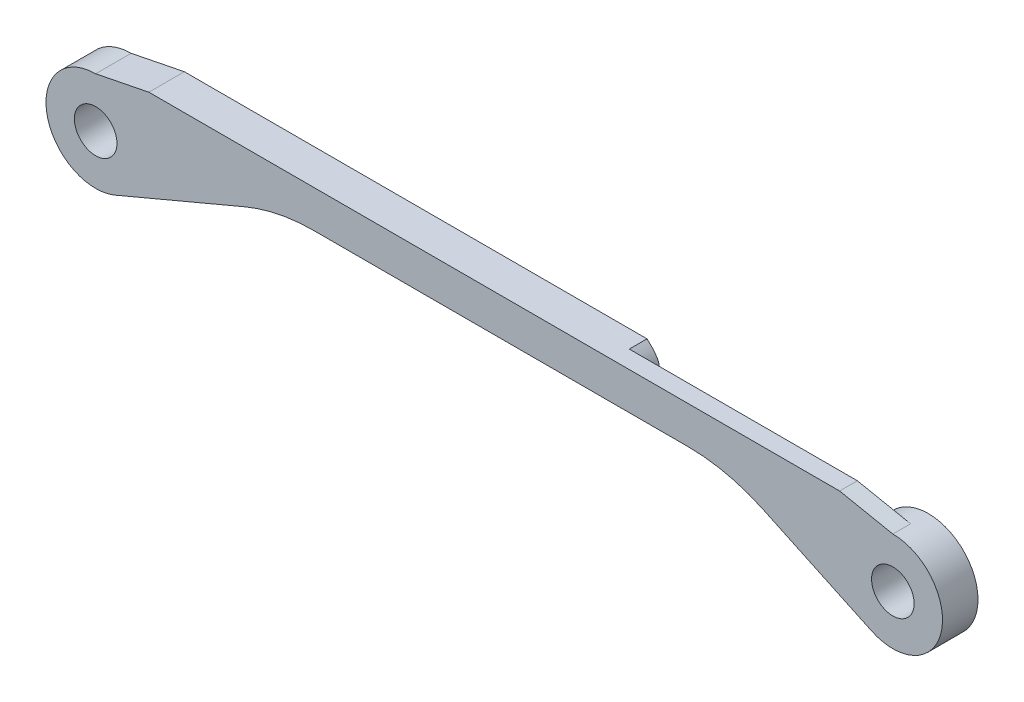
ISO-10303-21;
HEADER;
FILE_DESCRIPTION(('STEP AP214'),'2;1');
FILE_NAME('part.step','',(''),(''),'','','');
FILE_SCHEMA(('AUTOMOTIVE_DESIGN { 1 0 10303 214 1 1 1 1 }'));
ENDSEC;
DATA;
#1=APPLICATION_CONTEXT('core data for automotive mechanical design processes');
#2=APPLICATION_PROTOCOL_DEFINITION('international standard','automotive_design',2000,#1);
#3=PRODUCT_CONTEXT('',#1,'mechanical');
#4=PRODUCT('Part','Part','',(#3));
#5=PRODUCT_RELATED_PRODUCT_CATEGORY('part','',(#4));
#6=PRODUCT_DEFINITION_FORMATION('','',#4);
#7=PRODUCT_DEFINITION_CONTEXT('part definition',#1,'design');
#8=PRODUCT_DEFINITION('design','',#6,#7);
#9=PRODUCT_DEFINITION_SHAPE('','',#8);
#10=(LENGTH_UNIT() NAMED_UNIT(*) SI_UNIT(.MILLI.,.METRE.));
#11=(NAMED_UNIT(*) PLANE_ANGLE_UNIT() SI_UNIT($,.RADIAN.));
#12=(NAMED_UNIT(*) SI_UNIT($,.STERADIAN.) SOLID_ANGLE_UNIT());
#13=UNCERTAINTY_MEASURE_WITH_UNIT(LENGTH_MEASURE(1.E-05),#10,'distance_accuracy_value','');
#14=(GEOMETRIC_REPRESENTATION_CONTEXT(3) GLOBAL_UNCERTAINTY_ASSIGNED_CONTEXT((#13)) GLOBAL_UNIT_ASSIGNED_CONTEXT((#10,
#11,#12)) REPRESENTATION_CONTEXT('',''));
#15=CARTESIAN_POINT('',(0.,0.,0.));
#16=DIRECTION('',(0.,0.,1.));
#17=DIRECTION('',(1.,0.,0.));
#18=AXIS2_PLACEMENT_3D('',#15,#16,#17);
#19=CARTESIAN_POINT('',(-57.845130198065,-43.5295238724371,-5.));
#20=DIRECTION('',(0.,0.,-1.));
#21=DIRECTION('',(1.,0.,0.));
#22=AXIS2_PLACEMENT_3D('',#19,#20,#21);
#23=PLANE('',#22);
#24=DIRECTION('',(0.905027741446098,-0.425352544617962,0.));
#25=VECTOR('',#24,1.);
#26=CARTESIAN_POINT('',(-5.95493562465147,-12.6703883802454,-5.));
#27=LINE('',#26,#25);
#28=CARTESIAN_POINT('',(-36.577502967167,1.7218631998678,-5.));
#29=VERTEX_POINT('',#28);
#30=CARTESIAN_POINT('',(-5.95493562465147,-12.6703883802454,-5.));
#31=VERTEX_POINT('',#30);
#32=EDGE_CURVE('E161',#29,#31,#27,.T.);
#33=ORIENTED_EDGE('',*,*,#32,.F.);
#34=CARTESIAN_POINT('',(-57.845130198065,-43.5295238724371,-5.));
#35=DIRECTION('',(0.,0.,1.));
#36=DIRECTION('',(1.,0.,0.));
#37=AXIS2_PLACEMENT_3D('',#34,#35,#36);
#38=CIRCLE('',#37,50.);
#39=CARTESIAN_POINT('',(-57.845130198065,6.47047612756292,-5.));
#40=VERTEX_POINT('',#39);
#41=EDGE_CURVE('E165',#29,#40,#38,.T.);
#42=ORIENTED_EDGE('',*,*,#41,.T.);
#43=DIRECTION('',(1.,0.,0.));
#44=VECTOR('',#43,1.);
#45=CARTESIAN_POINT('',(0.,6.47047612756292,-5.));
#46=LINE('',#45,#44);
#47=CARTESIAN_POINT('',(-81.2732419921328,6.47047612756292,-5.));
#48=VERTEX_POINT('',#47);
#49=EDGE_CURVE('E451',#48,#40,#46,.T.);
#50=ORIENTED_EDGE('',*,*,#49,.F.);
#51=CARTESIAN_POINT('',(-79.2716069594435,17.,-5.));
#52=CARTESIAN_POINT('',(-71.4034946211549,10.2559083754016,-5.));
#53=CARTESIAN_POINT('',(-81.2732419921328,6.47047612756292,-5.));
#54=B_SPLINE_CURVE_WITH_KNOTS('',2,(#51,#52,#53),.UNSPECIFIED.,.F.,.F.,(3,3),(0.,1.),.UNSPECIFIED.);
#55=CARTESIAN_POINT('',(-79.2716069594435,17.,-5.));
#56=VERTEX_POINT('',#55);
#57=EDGE_CURVE('E163',#56,#48,#54,.T.);
#58=ORIENTED_EDGE('',*,*,#57,.F.);
#59=DIRECTION('',(-1.,0.,0.));
#60=VECTOR('',#59,1.);
#61=CARTESIAN_POINT('',(0.,17.,-5.));
#62=LINE('',#61,#60);
#63=CARTESIAN_POINT('',(-15.,17.,-5.));
#64=VERTEX_POINT('',#63);
#65=EDGE_CURVE('E160',#64,#56,#62,.T.);
#66=ORIENTED_EDGE('',*,*,#65,.F.);
#67=DIRECTION('',(-0.98058067569092,0.196116135138185,0.));
#68=VECTOR('',#67,1.);
#69=CARTESIAN_POINT('',(2.69230769230771,13.4615384615385,-5.));
#70=LINE('',#69,#68);
#71=CARTESIAN_POINT('',(0.,14.,-5.));
#72=VERTEX_POINT('',#71);
#73=EDGE_CURVE('E139',#72,#64,#70,.T.);
#74=ORIENTED_EDGE('',*,*,#73,.F.);
#75=CARTESIAN_POINT('',(0.,0.,-5.));
#76=DIRECTION('',(0.,0.,1.));
#77=DIRECTION('',(1.,0.,0.));
#78=AXIS2_PLACEMENT_3D('',#75,#76,#77);
#79=CIRCLE('',#78,14.);
#80=EDGE_CURVE('E149',#72,#31,#79,.T.);
#81=ORIENTED_EDGE('',*,*,#80,.T.);
#82=EDGE_LOOP('',(#33,#42,#50,#58,#66,#74,#81));
#83=FACE_BOUND('',#82,.T.);
#84=ADVANCED_FACE('F45',(#83),#23,.T.);
#85=CARTESIAN_POINT('',(-5.95493562465147,-12.6703883802454,-10.));
#86=DIRECTION('',(0.425352544617962,0.905027741446098,0.));
#87=DIRECTION('',(-0.905027741446098,0.425352544617962,0.));
#88=AXIS2_PLACEMENT_3D('',#85,#86,#87);
#89=PLANE('',#88);
#90=ORIENTED_EDGE('',*,*,#32,.T.);
#91=DIRECTION('',(0.,0.,1.));
#92=VECTOR('',#91,1.);
#93=CARTESIAN_POINT('',(-5.95493562465147,-12.6703883802454,-10.));
#94=LINE('',#93,#92);
#95=CARTESIAN_POINT('',(-5.95493562465147,-12.6703883802454,0.));
#96=VERTEX_POINT('',#95);
#97=EDGE_CURVE('E145',#31,#96,#94,.T.);
#98=ORIENTED_EDGE('',*,*,#97,.T.);
#99=DIRECTION('',(0.905027741446098,-0.425352544617962,0.));
#100=VECTOR('',#99,1.);
#101=CARTESIAN_POINT('',(-5.95493562465147,-12.6703883802454,0.));
#102=LINE('',#101,#100);
#103=CARTESIAN_POINT('',(-36.577502967167,1.7218631998678,0.));
#104=VERTEX_POINT('',#103);
#105=EDGE_CURVE('E463',#104,#96,#102,.T.);
#106=ORIENTED_EDGE('',*,*,#105,.F.);
#107=DIRECTION('',(0.,0.,1.));
#108=VECTOR('',#107,1.);
#109=CARTESIAN_POINT('',(-36.5775029671669,1.7218631998678,0.));
#110=LINE('',#109,#108);
#111=EDGE_CURVE('E457',#29,#104,#110,.T.);
#112=ORIENTED_EDGE('',*,*,#111,.F.);
#113=EDGE_LOOP('',(#90,#98,#106,#112));
#114=FACE_BOUND('',#113,.T.);
#115=ADVANCED_FACE('F230',(#114),#89,.F.);
#116=CARTESIAN_POINT('',(0.,0.,-10.));
#117=DIRECTION('',(0.,0.,1.));
#118=DIRECTION('',(-1.,0.,0.));
#119=AXIS2_PLACEMENT_3D('',#116,#117,#118);
#120=CYLINDRICAL_SURFACE('',#119,14.);
#121=DIRECTION('',(0.,0.,1.));
#122=VECTOR('',#121,1.);
#123=CARTESIAN_POINT('',(0.,14.,-10.));
#124=LINE('',#123,#122);
#125=CARTESIAN_POINT('',(0.,14.,0.));
#126=VERTEX_POINT('',#125);
#127=EDGE_CURVE('E134',#72,#126,#124,.T.);
#128=ORIENTED_EDGE('',*,*,#127,.T.);
#129=CARTESIAN_POINT('',(0.,0.,0.));
#130=DIRECTION('',(0.,0.,1.));
#131=DIRECTION('',(1.,0.,0.));
#132=AXIS2_PLACEMENT_3D('',#129,#130,#131);
#133=CIRCLE('',#132,14.);
#134=EDGE_CURVE('E464',#96,#126,#133,.T.);
#135=ORIENTED_EDGE('',*,*,#134,.F.);
#136=ORIENTED_EDGE('',*,*,#97,.F.);
#137=ORIENTED_EDGE('',*,*,#80,.F.);
#138=EDGE_LOOP('',(#128,#135,#136,#137));
#139=FACE_BOUND('',#138,.T.);
#140=CARTESIAN_POINT('',(0.,0.,-10.));
#141=DIRECTION('',(0.,0.,1.));
#142=DIRECTION('',(1.,0.,0.));
#143=AXIS2_PLACEMENT_3D('',#140,#141,#142);
#144=CIRCLE('',#143,14.);
#145=CARTESIAN_POINT('',(14.,0.,-10.));
#146=VERTEX_POINT('',#145);
#147=EDGE_CURVE('E449',#146,#146,#144,.T.);
#148=ORIENTED_EDGE('',*,*,#147,.T.);
#149=EDGE_LOOP('',(#148));
#150=FACE_BOUND('',#149,.T.);
#151=ADVANCED_FACE('F150',(#139,#150),#120,.T.);
#152=CARTESIAN_POINT('',(2.69230769230771,13.4615384615385,-10.));
#153=DIRECTION('',(0.196116135138185,0.98058067569092,0.));
#154=DIRECTION('',(-0.98058067569092,0.196116135138185,0.));
#155=AXIS2_PLACEMENT_3D('',#152,#153,#154);
#156=PLANE('',#155);
#157=DIRECTION('',(0.,0.,1.));
#158=VECTOR('',#157,1.);
#159=CARTESIAN_POINT('',(-15.,17.,-10.));
#160=LINE('',#159,#158);
#161=CARTESIAN_POINT('',(-15.,17.,0.));
#162=VERTEX_POINT('',#161);
#163=EDGE_CURVE('E146',#64,#162,#160,.T.);
#164=ORIENTED_EDGE('',*,*,#163,.T.);
#165=DIRECTION('',(0.98058067569092,-0.196116135138185,0.));
#166=VECTOR('',#165,1.);
#167=CARTESIAN_POINT('',(2.69230769230771,13.4615384615385,0.));
#168=LINE('',#167,#166);
#169=EDGE_CURVE('E142',#162,#126,#168,.T.);
#170=ORIENTED_EDGE('',*,*,#169,.T.);
#171=ORIENTED_EDGE('',*,*,#127,.F.);
#172=ORIENTED_EDGE('',*,*,#73,.T.);
#173=EDGE_LOOP('',(#164,#170,#171,#172));
#174=FACE_BOUND('',#173,.T.);
#175=ADVANCED_FACE('F137',(#174),#156,.T.);
#176=CARTESIAN_POINT('',(0.,0.,-10.));
#177=DIRECTION('',(0.,0.,1.));
#178=DIRECTION('',(-1.,0.,0.));
#179=AXIS2_PLACEMENT_3D('',#176,#177,#178);
#180=CYLINDRICAL_SURFACE('',#179,6.);
#181=CARTESIAN_POINT('',(0.,0.,0.));
#182=DIRECTION('',(0.,0.,1.));
#183=DIRECTION('',(1.,0.,0.));
#184=AXIS2_PLACEMENT_3D('',#181,#182,#183);
#185=CIRCLE('',#184,6.);
#186=CARTESIAN_POINT('',(6.,0.,0.));
#187=VERTEX_POINT('',#186);
#188=EDGE_CURVE('E486',#187,#187,#185,.T.);
#189=ORIENTED_EDGE('',*,*,#188,.T.);
#190=EDGE_LOOP('',(#189));
#191=FACE_BOUND('',#190,.T.);
#192=CARTESIAN_POINT('',(0.,0.,-10.));
#193=DIRECTION('',(0.,0.,1.));
#194=DIRECTION('',(1.,0.,0.));
#195=AXIS2_PLACEMENT_3D('',#192,#193,#194);
#196=CIRCLE('',#195,6.);
#197=CARTESIAN_POINT('',(6.,0.,-10.));
#198=VERTEX_POINT('',#197);
#199=EDGE_CURVE('E156',#198,#198,#196,.F.);
#200=ORIENTED_EDGE('',*,*,#199,.T.);
#201=EDGE_LOOP('',(#200));
#202=FACE_BOUND('',#201,.T.);
#203=ADVANCED_FACE('F202',(#191,#202),#180,.F.);
#204=CARTESIAN_POINT('',(-57.845130198065,-43.5295238724371,-10.));
#205=DIRECTION('',(0.,0.,-1.));
#206=DIRECTION('',(1.,0.,0.));
#207=AXIS2_PLACEMENT_3D('',#204,#205,#206);
#208=CYLINDRICAL_SURFACE('',#207,50.);
#209=ORIENTED_EDGE('',*,*,#41,.F.);
#210=ORIENTED_EDGE('',*,*,#111,.T.);
#211=CARTESIAN_POINT('',(-57.845130198065,-43.5295238724371,0.));
#212=DIRECTION('',(0.,0.,1.));
#213=DIRECTION('',(1.,0.,0.));
#214=AXIS2_PLACEMENT_3D('',#211,#212,#213);
#215=CIRCLE('',#214,50.);
#216=CARTESIAN_POINT('',(-57.845130198065,6.47047612756292,0.));
#217=VERTEX_POINT('',#216);
#218=EDGE_CURVE('E459',#104,#217,#215,.T.);
#219=ORIENTED_EDGE('',*,*,#218,.T.);
#220=DIRECTION('',(0.,0.,1.));
#221=VECTOR('',#220,1.);
#222=CARTESIAN_POINT('',(-57.845130198065,6.47047612756292,-10.));
#223=LINE('',#222,#221);
#224=EDGE_CURVE('E60',#217,#40,#223,.F.);
#225=ORIENTED_EDGE('',*,*,#224,.T.);
#226=EDGE_LOOP('',(#209,#210,#219,#225));
#227=FACE_BOUND('',#226,.T.);
#228=ADVANCED_FACE('F205',(#227),#208,.F.);
#229=CARTESIAN_POINT('',(0.,17.,-10.));
#230=DIRECTION('',(0.,1.,0.));
#231=DIRECTION('',(-1.,0.,0.));
#232=AXIS2_PLACEMENT_3D('',#229,#230,#231);
#233=PLANE('',#232);
#234=DIRECTION('',(0.,0.,-1.));
#235=VECTOR('',#234,1.);
#236=CARTESIAN_POINT('',(-79.2716069594435,17.,-5.));
#237=LINE('',#236,#235);
#238=CARTESIAN_POINT('',(-79.2716069594435,17.,-10.));
#239=VERTEX_POINT('',#238);
#240=EDGE_CURVE('E174',#56,#239,#237,.T.);
#241=ORIENTED_EDGE('',*,*,#240,.T.);
#242=DIRECTION('',(1.,0.,0.));
#243=VECTOR('',#242,1.);
#244=CARTESIAN_POINT('',(0.,17.,-10.));
#245=LINE('',#244,#243);
#246=CARTESIAN_POINT('',(-209.65,17.,-10.));
#247=VERTEX_POINT('',#246);
#248=EDGE_CURVE('E492',#247,#239,#245,.T.);
#249=ORIENTED_EDGE('',*,*,#248,.F.);
#250=DIRECTION('',(0.,0.,1.));
#251=VECTOR('',#250,1.);
#252=CARTESIAN_POINT('',(-209.65,17.,-10.));
#253=LINE('',#252,#251);
#254=CARTESIAN_POINT('',(-209.65,17.,0.));
#255=VERTEX_POINT('',#254);
#256=EDGE_CURVE('E499',#247,#255,#253,.T.);
#257=ORIENTED_EDGE('',*,*,#256,.T.);
#258=DIRECTION('',(1.,0.,0.));
#259=VECTOR('',#258,1.);
#260=CARTESIAN_POINT('',(0.,17.,0.));
#261=LINE('',#260,#259);
#262=EDGE_CURVE('E474',#255,#162,#261,.T.);
#263=ORIENTED_EDGE('',*,*,#262,.T.);
#264=ORIENTED_EDGE('',*,*,#163,.F.);
#265=ORIENTED_EDGE('',*,*,#65,.T.);
#266=EDGE_LOOP('',(#241,#249,#257,#263,#264,#265));
#267=FACE_BOUND('',#266,.T.);
#268=ADVANCED_FACE('F221',(#267),#233,.T.);
#269=CARTESIAN_POINT('',(-11.3326923076922,56.6634615384613,-10.));
#270=DIRECTION('',(0.196116135138183,-0.98058067569092,0.));
#271=DIRECTION('',(0.98058067569092,0.196116135138183,0.));
#272=AXIS2_PLACEMENT_3D('',#269,#270,#271);
#273=PLANE('',#272);
#274=DIRECTION('',(-0.98058067569092,-0.196116135138183,0.));
#275=VECTOR('',#274,1.);
#276=CARTESIAN_POINT('',(-11.3326923076922,56.6634615384613,0.));
#277=LINE('',#276,#275);
#278=CARTESIAN_POINT('',(-224.65,14.,0.));
#279=VERTEX_POINT('',#278);
#280=EDGE_CURVE('E476',#255,#279,#277,.T.);
#281=ORIENTED_EDGE('',*,*,#280,.F.);
#282=ORIENTED_EDGE('',*,*,#256,.F.);
#283=DIRECTION('',(-0.98058067569092,-0.196116135138183,0.));
#284=VECTOR('',#283,1.);
#285=CARTESIAN_POINT('',(-11.3326923076922,56.6634615384613,-10.));
#286=LINE('',#285,#284);
#287=CARTESIAN_POINT('',(-224.65,14.,-10.));
#288=VERTEX_POINT('',#287);
#289=EDGE_CURVE('E522',#247,#288,#286,.T.);
#290=ORIENTED_EDGE('',*,*,#289,.T.);
#291=DIRECTION('',(0.,0.,1.));
#292=VECTOR('',#291,1.);
#293=CARTESIAN_POINT('',(-224.65,14.,-10.));
#294=LINE('',#293,#292);
#295=EDGE_CURVE('E496',#288,#279,#294,.T.);
#296=ORIENTED_EDGE('',*,*,#295,.T.);
#297=EDGE_LOOP('',(#281,#282,#290,#296));
#298=FACE_BOUND('',#297,.T.);
#299=ADVANCED_FACE('F217',(#298),#273,.F.);
#300=CARTESIAN_POINT('',(-224.65,0.,-10.));
#301=DIRECTION('',(0.,0.,1.));
#302=DIRECTION('',(-1.,0.,0.));
#303=AXIS2_PLACEMENT_3D('',#300,#301,#302);
#304=CYLINDRICAL_SURFACE('',#303,14.);
#305=CARTESIAN_POINT('',(-224.65,0.,0.));
#306=DIRECTION('',(0.,0.,1.));
#307=DIRECTION('',(1.,0.,0.));
#308=AXIS2_PLACEMENT_3D('',#305,#306,#307);
#309=CIRCLE('',#308,14.);
#310=CARTESIAN_POINT('',(-219.205808477167,-12.8980920551341,0.));
#311=VERTEX_POINT('',#310);
#312=EDGE_CURVE('E479',#279,#311,#309,.T.);
#313=ORIENTED_EDGE('',*,*,#312,.F.);
#314=ORIENTED_EDGE('',*,*,#295,.F.);
#315=CARTESIAN_POINT('',(-224.65,0.,-10.));
#316=DIRECTION('',(0.,0.,1.));
#317=DIRECTION('',(1.,0.,0.));
#318=AXIS2_PLACEMENT_3D('',#315,#316,#317);
#319=CIRCLE('',#318,14.);
#320=CARTESIAN_POINT('',(-219.205808477167,-12.8980920551341,-10.));
#321=VERTEX_POINT('',#320);
#322=EDGE_CURVE('E525',#288,#321,#319,.T.);
#323=ORIENTED_EDGE('',*,*,#322,.T.);
#324=DIRECTION('',(0.,0.,1.));
#325=VECTOR('',#324,1.);
#326=CARTESIAN_POINT('',(-219.205808477167,-12.8980920551341,-10.));
#327=LINE('',#326,#325);
#328=EDGE_CURVE('E493',#321,#311,#327,.T.);
#329=ORIENTED_EDGE('',*,*,#328,.T.);
#330=EDGE_LOOP('',(#313,#314,#323,#329));
#331=FACE_BOUND('',#330,.T.);
#332=ADVANCED_FACE('F213',(#331),#304,.T.);
#333=CARTESIAN_POINT('',(-28.527497627278,67.5858461180238,-10.));
#334=DIRECTION('',(0.38887082305951,-0.921292289652431,0.));
#335=DIRECTION('',(0.921292289652431,0.38887082305951,0.));
#336=AXIS2_PLACEMENT_3D('',#333,#334,#335);
#337=PLANE('',#336);
#338=DIRECTION('',(-0.921292289652431,-0.38887082305951,0.));
#339=VECTOR('',#338,1.);
#340=CARTESIAN_POINT('',(-28.527497627278,67.5858461180238,0.));
#341=LINE('',#340,#339);
#342=CARTESIAN_POINT('',(-182.642324278252,2.53509061018449,0.));
#343=VERTEX_POINT('',#342);
#344=EDGE_CURVE('E482',#343,#311,#341,.T.);
#345=ORIENTED_EDGE('',*,*,#344,.T.);
#346=ORIENTED_EDGE('',*,*,#328,.F.);
#347=DIRECTION('',(-0.921292289652431,-0.38887082305951,0.));
#348=VECTOR('',#347,1.);
#349=CARTESIAN_POINT('',(-28.527497627278,67.5858461180238,-10.));
#350=LINE('',#349,#348);
#351=CARTESIAN_POINT('',(-182.642324278252,2.53509061018449,-10.));
#352=VERTEX_POINT('',#351);
#353=EDGE_CURVE('E515',#352,#321,#350,.T.);
#354=ORIENTED_EDGE('',*,*,#353,.F.);
#355=DIRECTION('',(0.,0.,1.));
#356=VECTOR('',#355,1.);
#357=CARTESIAN_POINT('',(-182.642324278252,2.53509061018448,-10.));
#358=LINE('',#357,#356);
#359=EDGE_CURVE('E507',#343,#352,#358,.F.);
#360=ORIENTED_EDGE('',*,*,#359,.F.);
#361=EDGE_LOOP('',(#345,#346,#354,#360));
#362=FACE_BOUND('',#361,.T.);
#363=ADVANCED_FACE('F209',(#362),#337,.T.);
#364=CARTESIAN_POINT('',(0.,6.47047612756292,-10.));
#365=DIRECTION('',(0.,1.,0.));
#366=DIRECTION('',(-1.,0.,0.));
#367=AXIS2_PLACEMENT_3D('',#364,#365,#366);
#368=PLANE('',#367);
#369=ORIENTED_EDGE('',*,*,#49,.T.);
#370=ORIENTED_EDGE('',*,*,#224,.F.);
#371=DIRECTION('',(1.,0.,0.));
#372=VECTOR('',#371,1.);
#373=CARTESIAN_POINT('',(0.,6.47047612756292,0.));
#374=LINE('',#373,#372);
#375=CARTESIAN_POINT('',(-163.198783125276,6.47047612756292,0.));
#376=VERTEX_POINT('',#375);
#377=EDGE_CURVE('E484',#376,#217,#374,.T.);
#378=ORIENTED_EDGE('',*,*,#377,.F.);
#379=DIRECTION('',(0.,0.,1.));
#380=VECTOR('',#379,1.);
#381=CARTESIAN_POINT('',(-163.198783125276,6.47047612756292,-10.));
#382=LINE('',#381,#380);
#383=CARTESIAN_POINT('',(-163.198783125276,6.47047612756292,-10.));
#384=VERTEX_POINT('',#383);
#385=EDGE_CURVE('E460',#384,#376,#382,.T.);
#386=ORIENTED_EDGE('',*,*,#385,.F.);
#387=DIRECTION('',(1.,0.,0.));
#388=VECTOR('',#387,1.);
#389=CARTESIAN_POINT('',(0.,6.47047612756292,-10.));
#390=LINE('',#389,#388);
#391=CARTESIAN_POINT('',(-81.2732419921328,6.47047612756292,-10.));
#392=VERTEX_POINT('',#391);
#393=EDGE_CURVE('E531',#384,#392,#390,.T.);
#394=ORIENTED_EDGE('',*,*,#393,.T.);
#395=DIRECTION('',(0.,0.,-1.));
#396=VECTOR('',#395,1.);
#397=CARTESIAN_POINT('',(-81.2732419921328,6.47047612756292,-5.));
#398=LINE('',#397,#396);
#399=EDGE_CURVE('E465',#48,#392,#398,.T.);
#400=ORIENTED_EDGE('',*,*,#399,.F.);
#401=EDGE_LOOP('',(#369,#370,#378,#386,#394,#400));
#402=FACE_BOUND('',#401,.T.);
#403=ADVANCED_FACE('F200',(#402),#368,.F.);
#404=CARTESIAN_POINT('',(-224.65,0.,-10.));
#405=DIRECTION('',(0.,0.,1.));
#406=DIRECTION('',(-1.,0.,0.));
#407=AXIS2_PLACEMENT_3D('',#404,#405,#406);
#408=CYLINDRICAL_SURFACE('',#407,5.99999999999999);
#409=CARTESIAN_POINT('',(-224.65,0.,-10.));
#410=DIRECTION('',(0.,0.,1.));
#411=DIRECTION('',(1.,0.,0.));
#412=AXIS2_PLACEMENT_3D('',#409,#410,#411);
#413=CIRCLE('',#412,5.99999999999999);
#414=CARTESIAN_POINT('',(-218.65,0.,-10.));
#415=VERTEX_POINT('',#414);
#416=EDGE_CURVE('E470',#415,#415,#413,.T.);
#417=ORIENTED_EDGE('',*,*,#416,.F.);
#418=EDGE_LOOP('',(#417));
#419=FACE_BOUND('',#418,.T.);
#420=CARTESIAN_POINT('',(-224.65,0.,0.));
#421=DIRECTION('',(0.,0.,1.));
#422=DIRECTION('',(1.,0.,0.));
#423=AXIS2_PLACEMENT_3D('',#420,#421,#422);
#424=CIRCLE('',#423,5.99999999999999);
#425=CARTESIAN_POINT('',(-218.65,0.,0.));
#426=VERTEX_POINT('',#425);
#427=EDGE_CURVE('E489',#426,#426,#424,.T.);
#428=ORIENTED_EDGE('',*,*,#427,.T.);
#429=EDGE_LOOP('',(#428));
#430=FACE_BOUND('',#429,.T.);
#431=ADVANCED_FACE('F194',(#419,#430),#408,.F.);
#432=CARTESIAN_POINT('',(0.,0.,-10.));
#433=DIRECTION('',(0.,0.,-1.));
#434=DIRECTION('',(1.,0.,0.));
#435=AXIS2_PLACEMENT_3D('',#432,#433,#434);
#436=PLANE('',#435);
#437=CARTESIAN_POINT('',(-79.2716069594435,17.,-10.));
#438=CARTESIAN_POINT('',(-71.4034946211549,10.2559083754016,-10.));
#439=CARTESIAN_POINT('',(-81.2732419921328,6.47047612756292,-10.));
#440=B_SPLINE_CURVE_WITH_KNOTS('',2,(#437,#438,#439),.UNSPECIFIED.,.F.,.F.,(3,3),(0.,1.),.UNSPECIFIED.);
#441=EDGE_CURVE('E175',#239,#392,#440,.T.);
#442=ORIENTED_EDGE('',*,*,#441,.T.);
#443=ORIENTED_EDGE('',*,*,#393,.F.);
#444=CARTESIAN_POINT('',(-163.198783125276,-43.5295238724371,-10.));
#445=DIRECTION('',(0.,0.,1.));
#446=DIRECTION('',(1.,0.,0.));
#447=AXIS2_PLACEMENT_3D('',#444,#445,#446);
#448=CIRCLE('',#447,50.);
#449=EDGE_CURVE('E11',#352,#384,#448,.F.);
#450=ORIENTED_EDGE('',*,*,#449,.F.);
#451=ORIENTED_EDGE('',*,*,#353,.T.);
#452=ORIENTED_EDGE('',*,*,#322,.F.);
#453=ORIENTED_EDGE('',*,*,#289,.F.);
#454=ORIENTED_EDGE('',*,*,#248,.T.);
#455=EDGE_LOOP('',(#442,#443,#450,#451,#452,#453,#454));
#456=FACE_BOUND('',#455,.T.);
#457=ORIENTED_EDGE('',*,*,#416,.T.);
#458=EDGE_LOOP('',(#457));
#459=FACE_BOUND('',#458,.T.);
#460=ADVANCED_FACE('F190',(#456,#459),#436,.T.);
#461=CARTESIAN_POINT('',(0.,0.,0.));
#462=DIRECTION('',(0.,0.,-1.));
#463=DIRECTION('',(1.,0.,0.));
#464=AXIS2_PLACEMENT_3D('',#461,#462,#463);
#465=PLANE('',#464);
#466=ORIENTED_EDGE('',*,*,#105,.T.);
#467=ORIENTED_EDGE('',*,*,#134,.T.);
#468=ORIENTED_EDGE('',*,*,#169,.F.);
#469=ORIENTED_EDGE('',*,*,#262,.F.);
#470=ORIENTED_EDGE('',*,*,#280,.T.);
#471=ORIENTED_EDGE('',*,*,#312,.T.);
#472=ORIENTED_EDGE('',*,*,#344,.F.);
#473=CARTESIAN_POINT('',(-163.198783125276,-43.5295238724371,0.));
#474=DIRECTION('',(0.,0.,1.));
#475=DIRECTION('',(1.,0.,0.));
#476=AXIS2_PLACEMENT_3D('',#473,#474,#475);
#477=CIRCLE('',#476,50.);
#478=EDGE_CURVE('E53',#376,#343,#477,.T.);
#479=ORIENTED_EDGE('',*,*,#478,.F.);
#480=ORIENTED_EDGE('',*,*,#377,.T.);
#481=ORIENTED_EDGE('',*,*,#218,.F.);
#482=EDGE_LOOP('',(#466,#467,#468,#469,#470,#471,#472,#479,#480,#481));
#483=FACE_BOUND('',#482,.T.);
#484=ORIENTED_EDGE('',*,*,#188,.F.);
#485=EDGE_LOOP('',(#484));
#486=FACE_BOUND('',#485,.T.);
#487=ORIENTED_EDGE('',*,*,#427,.F.);
#488=EDGE_LOOP('',(#487));
#489=FACE_BOUND('',#488,.T.);
#490=ADVANCED_FACE('F193',(#483,#486,#489),#465,.F.);
#491=CARTESIAN_POINT('',(-163.198783125276,-43.5295238724371,-10.));
#492=DIRECTION('',(0.,0.,1.));
#493=DIRECTION('',(-1.,0.,0.));
#494=AXIS2_PLACEMENT_3D('',#491,#492,#493);
#495=CYLINDRICAL_SURFACE('',#494,50.);
#496=ORIENTED_EDGE('',*,*,#449,.T.);
#497=ORIENTED_EDGE('',*,*,#385,.T.);
#498=ORIENTED_EDGE('',*,*,#478,.T.);
#499=ORIENTED_EDGE('',*,*,#359,.T.);
#500=EDGE_LOOP('',(#496,#497,#498,#499));
#501=FACE_BOUND('',#500,.T.);
#502=ADVANCED_FACE('F47',(#501),#495,.F.);
#503=DIRECTION('',(0.,0.,-1.));
#504=VECTOR('',#503,1.);
#505=SURFACE_OF_LINEAR_EXTRUSION('',#54,#504);
#506=ORIENTED_EDGE('',*,*,#441,.F.);
#507=ORIENTED_EDGE('',*,*,#240,.F.);
#508=ORIENTED_EDGE('',*,*,#57,.T.);
#509=ORIENTED_EDGE('',*,*,#399,.T.);
#510=EDGE_LOOP('',(#506,#507,#508,#509));
#511=FACE_BOUND('',#510,.T.);
#512=ADVANCED_FACE('F183',(#511),#505,.T.);
#513=CARTESIAN_POINT('',(0.,0.,-10.));
#514=DIRECTION('',(0.,0.,-1.));
#515=DIRECTION('',(1.,0.,0.));
#516=AXIS2_PLACEMENT_3D('',#513,#514,#515);
#517=PLANE('',#516);
#518=ORIENTED_EDGE('',*,*,#199,.F.);
#519=EDGE_LOOP('',(#518));
#520=FACE_BOUND('',#519,.T.);
#521=ORIENTED_EDGE('',*,*,#147,.F.);
#522=EDGE_LOOP('',(#521));
#523=FACE_BOUND('',#522,.T.);
#524=ADVANCED_FACE('F187',(#520,#523),#517,.T.);
#525=CLOSED_SHELL('',(#84,#115,#151,#175,#203,#228,#268,#299,#332,#363,#403,#431,#460,#490,#502,
#512,#524));
#526=MANIFOLD_SOLID_BREP('B2',#525);
#527=ADVANCED_BREP_SHAPE_REPRESENTATION('',(#18,#526),#14);
#528=SHAPE_DEFINITION_REPRESENTATION(#9,#527);
ENDSEC;
END-ISO-10303-21;
